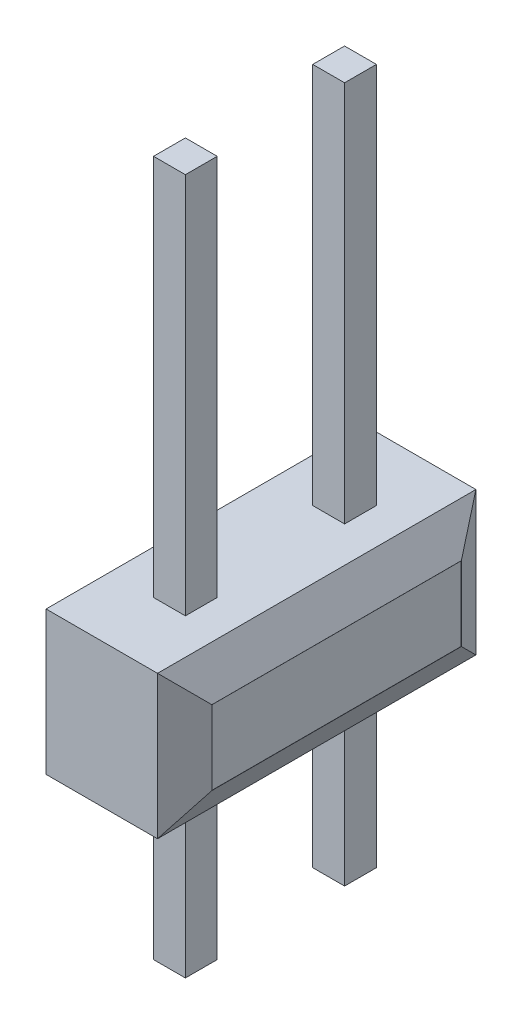
ISO-10303-21;
HEADER;
FILE_DESCRIPTION(('STEP AP214'),'2;1');
FILE_NAME('part.step','',(''),(''),'','','');
FILE_SCHEMA(('AUTOMOTIVE_DESIGN { 1 0 10303 214 1 1 1 1 }'));
ENDSEC;
DATA;
#1=APPLICATION_CONTEXT('core data for automotive mechanical design processes');
#2=APPLICATION_PROTOCOL_DEFINITION('international standard','automotive_design',2000,#1);
#3=PRODUCT_CONTEXT('',#1,'mechanical');
#4=PRODUCT('Part','Part','',(#3));
#5=PRODUCT_RELATED_PRODUCT_CATEGORY('part','',(#4));
#6=PRODUCT_DEFINITION_FORMATION('','',#4);
#7=PRODUCT_DEFINITION_CONTEXT('part definition',#1,'design');
#8=PRODUCT_DEFINITION('design','',#6,#7);
#9=PRODUCT_DEFINITION_SHAPE('','',#8);
#10=(LENGTH_UNIT() NAMED_UNIT(*) SI_UNIT(.MILLI.,.METRE.));
#11=(NAMED_UNIT(*) PLANE_ANGLE_UNIT() SI_UNIT($,.RADIAN.));
#12=(NAMED_UNIT(*) SI_UNIT($,.STERADIAN.) SOLID_ANGLE_UNIT());
#13=UNCERTAINTY_MEASURE_WITH_UNIT(LENGTH_MEASURE(1.E-05),#10,'distance_accuracy_value','');
#14=(GEOMETRIC_REPRESENTATION_CONTEXT(3) GLOBAL_UNCERTAINTY_ASSIGNED_CONTEXT((#13)) GLOBAL_UNIT_ASSIGNED_CONTEXT((#10,
#11,#12)) REPRESENTATION_CONTEXT('',''));
#15=CARTESIAN_POINT('',(0.,0.,0.));
#16=DIRECTION('',(0.,0.,1.));
#17=DIRECTION('',(1.,0.,0.));
#18=AXIS2_PLACEMENT_3D('',#15,#16,#17);
#19=CARTESIAN_POINT('',(-4.826,-1.143,2.032));
#20=DIRECTION('',(1.,0.,0.));
#21=DIRECTION('',(0.,0.,-1.));
#22=AXIS2_PLACEMENT_3D('',#19,#20,#21);
#23=PLANE('',#22);
#24=DIRECTION('',(0.,1.,0.));
#25=VECTOR('',#24,1.);
#26=CARTESIAN_POINT('',(-4.826,7.239,1.524));
#27=LINE('',#26,#25);
#28=CARTESIAN_POINT('',(-4.826,1.143,1.524));
#29=VERTEX_POINT('',#28);
#30=CARTESIAN_POINT('',(-4.826,7.239,1.524));
#31=VERTEX_POINT('',#30);
#32=EDGE_CURVE('E196',#29,#31,#27,.T.);
#33=ORIENTED_EDGE('',*,*,#32,.F.);
#34=DIRECTION('',(0.,0.,-1.));
#35=VECTOR('',#34,1.);
#36=CARTESIAN_POINT('',(-4.826,1.143,2.032));
#37=LINE('',#36,#35);
#38=CARTESIAN_POINT('',(-4.826,1.143,1.016));
#39=VERTEX_POINT('',#38);
#40=EDGE_CURVE('E20',#29,#39,#37,.T.);
#41=ORIENTED_EDGE('',*,*,#40,.T.);
#42=DIRECTION('',(0.,1.,0.));
#43=VECTOR('',#42,1.);
#44=CARTESIAN_POINT('',(-4.826,1.143,1.016));
#45=LINE('',#44,#43);
#46=CARTESIAN_POINT('',(-4.826,7.239,1.016));
#47=VERTEX_POINT('',#46);
#48=EDGE_CURVE('E194',#47,#39,#45,.F.);
#49=ORIENTED_EDGE('',*,*,#48,.F.);
#50=DIRECTION('',(0.,0.,1.));
#51=VECTOR('',#50,1.);
#52=CARTESIAN_POINT('',(-4.826,7.239,1.016));
#53=LINE('',#52,#51);
#54=EDGE_CURVE('E188',#31,#47,#53,.F.);
#55=ORIENTED_EDGE('',*,*,#54,.F.);
#56=EDGE_LOOP('',(#33,#41,#49,#55));
#57=FACE_BOUND('',#56,.T.);
#58=ADVANCED_FACE('F17',(#57),#23,.T.);
#59=CARTESIAN_POINT('',(-4.826,-1.143,2.032));
#60=DIRECTION('',(1.,0.,0.));
#61=DIRECTION('',(0.,0.,-1.));
#62=AXIS2_PLACEMENT_3D('',#59,#60,#61);
#63=PLANE('',#62);
#64=DIRECTION('',(0.,1.,0.));
#65=VECTOR('',#64,1.);
#66=CARTESIAN_POINT('',(-4.826,7.239,-1.016));
#67=LINE('',#66,#65);
#68=CARTESIAN_POINT('',(-4.826,1.143,-1.016));
#69=VERTEX_POINT('',#68);
#70=CARTESIAN_POINT('',(-4.826,7.239,-1.016));
#71=VERTEX_POINT('',#70);
#72=EDGE_CURVE('E226',#69,#71,#67,.T.);
#73=ORIENTED_EDGE('',*,*,#72,.F.);
#74=DIRECTION('',(0.,0.,-1.));
#75=VECTOR('',#74,1.);
#76=CARTESIAN_POINT('',(-4.826,1.143,2.032));
#77=LINE('',#76,#75);
#78=CARTESIAN_POINT('',(-4.826,1.143,-1.524));
#79=VERTEX_POINT('',#78);
#80=EDGE_CURVE('E200',#69,#79,#77,.T.);
#81=ORIENTED_EDGE('',*,*,#80,.T.);
#82=DIRECTION('',(0.,1.,0.));
#83=VECTOR('',#82,1.);
#84=CARTESIAN_POINT('',(-4.826,1.143,-1.524));
#85=LINE('',#84,#83);
#86=CARTESIAN_POINT('',(-4.826,7.239,-1.524));
#87=VERTEX_POINT('',#86);
#88=EDGE_CURVE('E224',#87,#79,#85,.F.);
#89=ORIENTED_EDGE('',*,*,#88,.F.);
#90=DIRECTION('',(0.,0.,1.));
#91=VECTOR('',#90,1.);
#92=CARTESIAN_POINT('',(-4.826,7.239,-1.524));
#93=LINE('',#92,#91);
#94=EDGE_CURVE('E241',#71,#87,#93,.F.);
#95=ORIENTED_EDGE('',*,*,#94,.F.);
#96=EDGE_LOOP('',(#73,#81,#89,#95));
#97=FACE_BOUND('',#96,.T.);
#98=ADVANCED_FACE('F222',(#97),#63,.T.);
#99=CARTESIAN_POINT('',(-3.937,0.593073868597,2.54));
#100=DIRECTION('',(0.866025403784329,-0.50000000000019,0.));
#101=DIRECTION('',(0.50000000000019,0.866025403784329,0.));
#102=AXIS2_PLACEMENT_3D('',#99,#100,#101);
#103=PLANE('',#102);
#104=DIRECTION('',(0.,0.,1.));
#105=VECTOR('',#104,1.);
#106=CARTESIAN_POINT('',(-3.93699999999993,0.59307386859704,2.54));
#107=LINE('',#106,#105);
#108=CARTESIAN_POINT('',(-3.93699999999996,0.59307386859701,-1.99007386859701));
#109=VERTEX_POINT('',#108);
#110=CARTESIAN_POINT('',(-3.93699999999999,0.59307386859701,1.99007386859701));
#111=VERTEX_POINT('',#110);
#112=EDGE_CURVE('E262',#109,#111,#107,.T.);
#113=ORIENTED_EDGE('',*,*,#112,.T.);
#114=DIRECTION('',(0.377964472999374,0.654653670731127,0.654653670690516));
#115=VECTOR('',#114,1.);
#116=CARTESIAN_POINT('',(-3.93800000000026,0.591341817789,1.98834181778915));
#117=LINE('',#116,#115);
#118=CARTESIAN_POINT('',(-3.93800000000011,0.591341817789027,1.98834181778904));
#119=VERTEX_POINT('',#118);
#120=EDGE_CURVE('E271',#119,#111,#117,.T.);
#121=ORIENTED_EDGE('',*,*,#120,.F.);
#122=DIRECTION('',(0.,0.,-1.));
#123=VECTOR('',#122,1.);
#124=CARTESIAN_POINT('',(-3.938,0.591341817789,2.032));
#125=LINE('',#124,#123);
#126=CARTESIAN_POINT('',(-3.93800000000014,0.591341817789053,-1.98834181778903));
#127=VERTEX_POINT('',#126);
#128=EDGE_CURVE('E276',#127,#119,#125,.F.);
#129=ORIENTED_EDGE('',*,*,#128,.F.);
#130=DIRECTION('',(0.377964472999283,0.654653670690359,-0.654653670731338));
#131=VECTOR('',#130,1.);
#132=CARTESIAN_POINT('',(-3.93800000000019,0.591341817789107,-1.988341817789));
#133=LINE('',#132,#131);
#134=EDGE_CURVE('E207',#127,#109,#133,.T.);
#135=ORIENTED_EDGE('',*,*,#134,.T.);
#136=EDGE_LOOP('',(#113,#121,#129,#135));
#137=FACE_BOUND('',#136,.T.);
#138=ADVANCED_FACE('F603',(#137),#103,.T.);
#139=CARTESIAN_POINT('',(-5.334,1.143,1.016));
#140=DIRECTION('',(0.,0.,-1.));
#141=DIRECTION('',(-1.,0.,0.));
#142=AXIS2_PLACEMENT_3D('',#139,#140,#141);
#143=PLANE('',#142);
#144=ORIENTED_EDGE('',*,*,#48,.T.);
#145=DIRECTION('',(-1.,0.,0.));
#146=VECTOR('',#145,1.);
#147=CARTESIAN_POINT('',(-5.334,1.143,1.016));
#148=LINE('',#147,#146);
#149=CARTESIAN_POINT('',(-5.334,1.143,1.016));
#150=VERTEX_POINT('',#149);
#151=EDGE_CURVE('E204',#39,#150,#148,.T.);
#152=ORIENTED_EDGE('',*,*,#151,.T.);
#153=DIRECTION('',(0.,1.,0.));
#154=VECTOR('',#153,1.);
#155=CARTESIAN_POINT('',(-5.334,-1.143,1.016));
#156=LINE('',#155,#154);
#157=CARTESIAN_POINT('',(-5.334,7.239,1.016));
#158=VERTEX_POINT('',#157);
#159=EDGE_CURVE('E256',#150,#158,#156,.T.);
#160=ORIENTED_EDGE('',*,*,#159,.T.);
#161=DIRECTION('',(1.,0.,0.));
#162=VECTOR('',#161,1.);
#163=CARTESIAN_POINT('',(-5.334,7.239,1.016));
#164=LINE('',#163,#162);
#165=EDGE_CURVE('E206',#47,#158,#164,.F.);
#166=ORIENTED_EDGE('',*,*,#165,.F.);
#167=EDGE_LOOP('',(#144,#152,#160,#166));
#168=FACE_BOUND('',#167,.T.);
#169=ADVANCED_FACE('F202',(#168),#143,.T.);
#170=CARTESIAN_POINT('',(-5.334,7.239,1.016));
#171=DIRECTION('',(0.,1.,0.));
#172=DIRECTION('',(0.,0.,1.));
#173=AXIS2_PLACEMENT_3D('',#170,#171,#172);
#174=PLANE('',#173);
#175=ORIENTED_EDGE('',*,*,#165,.T.);
#176=DIRECTION('',(0.,0.,-1.));
#177=VECTOR('',#176,1.);
#178=CARTESIAN_POINT('',(-5.334,7.239,2.032));
#179=LINE('',#178,#177);
#180=CARTESIAN_POINT('',(-5.334,7.239,1.524));
#181=VERTEX_POINT('',#180);
#182=EDGE_CURVE('E252',#158,#181,#179,.F.);
#183=ORIENTED_EDGE('',*,*,#182,.T.);
#184=DIRECTION('',(1.,0.,0.));
#185=VECTOR('',#184,1.);
#186=CARTESIAN_POINT('',(-5.334,7.239,1.524));
#187=LINE('',#186,#185);
#188=EDGE_CURVE('E247',#31,#181,#187,.F.);
#189=ORIENTED_EDGE('',*,*,#188,.F.);
#190=ORIENTED_EDGE('',*,*,#54,.T.);
#191=EDGE_LOOP('',(#175,#183,#189,#190));
#192=FACE_BOUND('',#191,.T.);
#193=ADVANCED_FACE('F251',(#192),#174,.T.);
#194=CARTESIAN_POINT('',(-5.334,7.239,1.524));
#195=DIRECTION('',(0.,0.,1.));
#196=DIRECTION('',(1.,0.,0.));
#197=AXIS2_PLACEMENT_3D('',#194,#195,#196);
#198=PLANE('',#197);
#199=DIRECTION('',(0.,1.,0.));
#200=VECTOR('',#199,1.);
#201=CARTESIAN_POINT('',(-5.334,-1.143,1.524));
#202=LINE('',#201,#200);
#203=CARTESIAN_POINT('',(-5.334,1.143,1.524));
#204=VERTEX_POINT('',#203);
#205=EDGE_CURVE('E258',#181,#204,#202,.F.);
#206=ORIENTED_EDGE('',*,*,#205,.T.);
#207=DIRECTION('',(1.,0.,0.));
#208=VECTOR('',#207,1.);
#209=CARTESIAN_POINT('',(-5.334,1.143,1.524));
#210=LINE('',#209,#208);
#211=EDGE_CURVE('E236',#204,#29,#210,.T.);
#212=ORIENTED_EDGE('',*,*,#211,.T.);
#213=ORIENTED_EDGE('',*,*,#32,.T.);
#214=ORIENTED_EDGE('',*,*,#188,.T.);
#215=EDGE_LOOP('',(#206,#212,#213,#214));
#216=FACE_BOUND('',#215,.T.);
#217=ADVANCED_FACE('F595',(#216),#198,.T.);
#218=CARTESIAN_POINT('',(-5.334,1.143,-1.524));
#219=DIRECTION('',(0.,0.,-1.));
#220=DIRECTION('',(-1.,0.,0.));
#221=AXIS2_PLACEMENT_3D('',#218,#219,#220);
#222=PLANE('',#221);
#223=ORIENTED_EDGE('',*,*,#88,.T.);
#224=DIRECTION('',(-1.,0.,0.));
#225=VECTOR('',#224,1.);
#226=CARTESIAN_POINT('',(-5.334,1.143,-1.524));
#227=LINE('',#226,#225);
#228=CARTESIAN_POINT('',(-5.334,1.143,-1.524));
#229=VERTEX_POINT('',#228);
#230=EDGE_CURVE('E233',#79,#229,#227,.T.);
#231=ORIENTED_EDGE('',*,*,#230,.T.);
#232=DIRECTION('',(0.,1.,0.));
#233=VECTOR('',#232,1.);
#234=CARTESIAN_POINT('',(-5.334,-1.143,-1.524));
#235=LINE('',#234,#233);
#236=CARTESIAN_POINT('',(-5.334,7.239,-1.524));
#237=VERTEX_POINT('',#236);
#238=EDGE_CURVE('E291',#229,#237,#235,.T.);
#239=ORIENTED_EDGE('',*,*,#238,.T.);
#240=DIRECTION('',(1.,0.,0.));
#241=VECTOR('',#240,1.);
#242=CARTESIAN_POINT('',(-5.334,7.239,-1.524));
#243=LINE('',#242,#241);
#244=EDGE_CURVE('E235',#87,#237,#243,.F.);
#245=ORIENTED_EDGE('',*,*,#244,.F.);
#246=EDGE_LOOP('',(#223,#231,#239,#245));
#247=FACE_BOUND('',#246,.T.);
#248=ADVANCED_FACE('F231',(#247),#222,.T.);
#249=CARTESIAN_POINT('',(-5.334,7.239,-1.524));
#250=DIRECTION('',(0.,1.,0.));
#251=DIRECTION('',(0.,0.,1.));
#252=AXIS2_PLACEMENT_3D('',#249,#250,#251);
#253=PLANE('',#252);
#254=ORIENTED_EDGE('',*,*,#244,.T.);
#255=DIRECTION('',(0.,0.,-1.));
#256=VECTOR('',#255,1.);
#257=CARTESIAN_POINT('',(-5.334,7.239,2.032));
#258=LINE('',#257,#256);
#259=CARTESIAN_POINT('',(-5.334,7.239,-1.016));
#260=VERTEX_POINT('',#259);
#261=EDGE_CURVE('E287',#237,#260,#258,.F.);
#262=ORIENTED_EDGE('',*,*,#261,.T.);
#263=DIRECTION('',(1.,0.,0.));
#264=VECTOR('',#263,1.);
#265=CARTESIAN_POINT('',(-5.334,7.239,-1.016));
#266=LINE('',#265,#264);
#267=EDGE_CURVE('E280',#71,#260,#266,.F.);
#268=ORIENTED_EDGE('',*,*,#267,.F.);
#269=ORIENTED_EDGE('',*,*,#94,.T.);
#270=EDGE_LOOP('',(#254,#262,#268,#269));
#271=FACE_BOUND('',#270,.T.);
#272=ADVANCED_FACE('F285',(#271),#253,.T.);
#273=CARTESIAN_POINT('',(-5.334,7.239,-1.016));
#274=DIRECTION('',(0.,0.,1.));
#275=DIRECTION('',(1.,0.,0.));
#276=AXIS2_PLACEMENT_3D('',#273,#274,#275);
#277=PLANE('',#276);
#278=DIRECTION('',(0.,1.,0.));
#279=VECTOR('',#278,1.);
#280=CARTESIAN_POINT('',(-5.334,-1.143,-1.016));
#281=LINE('',#280,#279);
#282=CARTESIAN_POINT('',(-5.334,1.143,-1.016));
#283=VERTEX_POINT('',#282);
#284=EDGE_CURVE('E293',#260,#283,#281,.F.);
#285=ORIENTED_EDGE('',*,*,#284,.T.);
#286=DIRECTION('',(1.,0.,0.));
#287=VECTOR('',#286,1.);
#288=CARTESIAN_POINT('',(-5.334,1.143,-1.016));
#289=LINE('',#288,#287);
#290=EDGE_CURVE('E278',#283,#69,#289,.T.);
#291=ORIENTED_EDGE('',*,*,#290,.T.);
#292=ORIENTED_EDGE('',*,*,#72,.T.);
#293=ORIENTED_EDGE('',*,*,#267,.T.);
#294=EDGE_LOOP('',(#285,#291,#292,#293));
#295=FACE_BOUND('',#294,.T.);
#296=ADVANCED_FACE('F586',(#295),#277,.T.);
#297=CARTESIAN_POINT('',(-3.938,-1.143,2.032));
#298=DIRECTION('',(1.,0.,0.));
#299=DIRECTION('',(0.,0.,-1.));
#300=AXIS2_PLACEMENT_3D('',#297,#298,#299);
#301=PLANE('',#300);
#302=DIRECTION('',(0.,1.,0.));
#303=VECTOR('',#302,1.);
#304=CARTESIAN_POINT('',(-3.93800000000026,1.143,1.98834181778915));
#305=LINE('',#304,#303);
#306=CARTESIAN_POINT('',(-3.93800000000002,-0.591341817789224,1.98834181778922));
#307=VERTEX_POINT('',#306);
#308=EDGE_CURVE('E273',#307,#119,#305,.T.);
#309=ORIENTED_EDGE('',*,*,#308,.F.);
#310=DIRECTION('',(0.,0.,1.));
#311=VECTOR('',#310,1.);
#312=CARTESIAN_POINT('',(-3.93799999999982,-0.591341817789898,2.54));
#313=LINE('',#312,#311);
#314=CARTESIAN_POINT('',(-3.938,-0.591341817789474,-1.98834181778903));
#315=VERTEX_POINT('',#314);
#316=EDGE_CURVE('E320',#315,#307,#313,.T.);
#317=ORIENTED_EDGE('',*,*,#316,.F.);
#318=DIRECTION('',(0.,1.,0.));
#319=VECTOR('',#318,1.);
#320=CARTESIAN_POINT('',(-3.93800000000019,1.143,-1.98834181778911));
#321=LINE('',#320,#319);
#322=EDGE_CURVE('E298',#127,#315,#321,.F.);
#323=ORIENTED_EDGE('',*,*,#322,.F.);
#324=ORIENTED_EDGE('',*,*,#128,.T.);
#325=EDGE_LOOP('',(#309,#317,#323,#324));
#326=FACE_BOUND('',#325,.T.);
#327=ADVANCED_FACE('F583',(#326),#301,.T.);
#328=CARTESIAN_POINT('',(-3.6195,1.143,2.54));
#329=DIRECTION('',(0.866025403784329,0.,-0.50000000000019));
#330=DIRECTION('',(-0.50000000000019,0.,-0.866025403784329));
#331=AXIS2_PLACEMENT_3D('',#328,#329,#330);
#332=PLANE('',#331);
#333=DIRECTION('',(0.,1.,0.));
#334=VECTOR('',#333,1.);
#335=CARTESIAN_POINT('',(-3.937,1.143,1.990073868597));
#336=LINE('',#335,#334);
#337=CARTESIAN_POINT('',(-3.93700000000003,-0.593073868597005,1.99007386859701));
#338=VERTEX_POINT('',#337);
#339=EDGE_CURVE('E310',#111,#338,#336,.F.);
#340=ORIENTED_EDGE('',*,*,#339,.T.);
#341=DIRECTION('',(0.377964472999364,-0.654653670690499,0.65465367073115));
#342=VECTOR('',#341,1.);
#343=CARTESIAN_POINT('',(-3.93800000000026,-0.591341817789148,1.988341817789));
#344=LINE('',#343,#342);
#345=EDGE_CURVE('E322',#307,#338,#344,.T.);
#346=ORIENTED_EDGE('',*,*,#345,.F.);
#347=ORIENTED_EDGE('',*,*,#308,.T.);
#348=ORIENTED_EDGE('',*,*,#120,.T.);
#349=EDGE_LOOP('',(#340,#346,#347,#348));
#350=FACE_BOUND('',#349,.T.);
#351=ADVANCED_FACE('F561',(#350),#332,.T.);
#352=CARTESIAN_POINT('',(-4.2545,1.143,2.54));
#353=DIRECTION('',(-0.866025403784329,-0.50000000000019,0.));
#354=DIRECTION('',(0.50000000000019,-0.866025403784329,0.));
#355=AXIS2_PLACEMENT_3D('',#352,#353,#354);
#356=PLANE('',#355);
#357=ORIENTED_EDGE('',*,*,#112,.F.);
#358=DIRECTION('',(0.37796447300938,-0.65465367070791,0.654653670707956));
#359=VECTOR('',#358,1.);
#360=CARTESIAN_POINT('',(-4.2545,1.143,-2.54));
#361=LINE('',#360,#359);
#362=CARTESIAN_POINT('',(-4.2545,1.143,-2.54));
#363=VERTEX_POINT('',#362);
#364=EDGE_CURVE('E268',#363,#109,#361,.T.);
#365=ORIENTED_EDGE('',*,*,#364,.F.);
#366=DIRECTION('',(0.,0.,1.));
#367=VECTOR('',#366,1.);
#368=CARTESIAN_POINT('',(-4.2545,1.143,0.));
#369=LINE('',#368,#367);
#370=CARTESIAN_POINT('',(-4.25450000000002,1.143,2.53999999999999));
#371=VERTEX_POINT('',#370);
#372=EDGE_CURVE('E328',#371,#363,#369,.F.);
#373=ORIENTED_EDGE('',*,*,#372,.F.);
#374=DIRECTION('',(0.377964473009379,-0.654653670707957,-0.65465367070791));
#375=VECTOR('',#374,1.);
#376=CARTESIAN_POINT('',(-4.25450000000007,1.143,2.53999999999996));
#377=LINE('',#376,#375);
#378=EDGE_CURVE('E307',#371,#111,#377,.T.);
#379=ORIENTED_EDGE('',*,*,#378,.T.);
#380=EDGE_LOOP('',(#357,#365,#373,#379));
#381=FACE_BOUND('',#380,.T.);
#382=ADVANCED_FACE('F567',(#381),#356,.F.);
#383=CARTESIAN_POINT('',(-6.19125,0.889,0.));
#384=DIRECTION('',(-0.847998304005144,0.52999894000309,0.));
#385=DIRECTION('',(-0.52999894000309,-0.847998304005144,0.));
#386=AXIS2_PLACEMENT_3D('',#383,#384,#385);
#387=PLANE('',#386);
#388=DIRECTION('',(0.,0.,1.));
#389=VECTOR('',#388,1.);
#390=CARTESIAN_POINT('',(-6.35,0.635,-2.032));
#391=LINE('',#390,#389);
#392=CARTESIAN_POINT('',(-6.34999999999999,0.634999999999996,2.032));
#393=VERTEX_POINT('',#392);
#394=CARTESIAN_POINT('',(-6.34999999999997,0.634999999999992,-2.03199999999999));
#395=VERTEX_POINT('',#394);
#396=EDGE_CURVE('E304',#393,#395,#391,.F.);
#397=ORIENTED_EDGE('',*,*,#396,.F.);
#398=DIRECTION('',(-0.404226041727153,-0.646761666763555,-0.646761666763598));
#399=VECTOR('',#398,1.);
#400=CARTESIAN_POINT('',(-6.03250000000005,1.143,2.54000000000003));
#401=LINE('',#400,#399);
#402=CARTESIAN_POINT('',(-6.03250000000002,1.14300000000001,2.54));
#403=VERTEX_POINT('',#402);
#404=EDGE_CURVE('E317',#403,#393,#401,.T.);
#405=ORIENTED_EDGE('',*,*,#404,.F.);
#406=DIRECTION('',(0.,0.,1.));
#407=VECTOR('',#406,1.);
#408=CARTESIAN_POINT('',(-6.0325,1.143,0.));
#409=LINE('',#408,#407);
#410=CARTESIAN_POINT('',(-6.03250000000001,1.14300000000001,-2.54));
#411=VERTEX_POINT('',#410);
#412=EDGE_CURVE('E331',#411,#403,#409,.T.);
#413=ORIENTED_EDGE('',*,*,#412,.F.);
#414=DIRECTION('',(-0.404226041727153,-0.646761666763597,0.646761666763555));
#415=VECTOR('',#414,1.);
#416=CARTESIAN_POINT('',(-6.03250000000003,1.14300000000002,-2.54));
#417=LINE('',#416,#415);
#418=EDGE_CURVE('E260',#411,#395,#417,.T.);
#419=ORIENTED_EDGE('',*,*,#418,.T.);
#420=EDGE_LOOP('',(#397,#405,#413,#419));
#421=FACE_BOUND('',#420,.T.);
#422=ADVANCED_FACE('F570',(#421),#387,.T.);
#423=CARTESIAN_POINT('',(-5.334,-1.143,2.032));
#424=DIRECTION('',(1.,0.,0.));
#425=DIRECTION('',(0.,0.,-1.));
#426=AXIS2_PLACEMENT_3D('',#423,#424,#425);
#427=PLANE('',#426);
#428=ORIENTED_EDGE('',*,*,#182,.F.);
#429=ORIENTED_EDGE('',*,*,#159,.F.);
#430=DIRECTION('',(0.,0.,1.));
#431=VECTOR('',#430,1.);
#432=CARTESIAN_POINT('',(-5.334,1.143,0.));
#433=LINE('',#432,#431);
#434=EDGE_CURVE('E213',#204,#150,#433,.F.);
#435=ORIENTED_EDGE('',*,*,#434,.F.);
#436=ORIENTED_EDGE('',*,*,#205,.F.);
#437=EDGE_LOOP('',(#428,#429,#435,#436));
#438=FACE_BOUND('',#437,.T.);
#439=ADVANCED_FACE('F255',(#438),#427,.F.);
#440=CARTESIAN_POINT('',(-5.334,-1.143,2.032));
#441=DIRECTION('',(1.,0.,0.));
#442=DIRECTION('',(0.,0.,-1.));
#443=AXIS2_PLACEMENT_3D('',#440,#441,#442);
#444=PLANE('',#443);
#445=ORIENTED_EDGE('',*,*,#261,.F.);
#446=ORIENTED_EDGE('',*,*,#238,.F.);
#447=DIRECTION('',(0.,0.,1.));
#448=VECTOR('',#447,1.);
#449=CARTESIAN_POINT('',(-5.334,1.143,0.));
#450=LINE('',#449,#448);
#451=EDGE_CURVE('E240',#283,#229,#450,.F.);
#452=ORIENTED_EDGE('',*,*,#451,.F.);
#453=ORIENTED_EDGE('',*,*,#284,.F.);
#454=EDGE_LOOP('',(#445,#446,#452,#453));
#455=FACE_BOUND('',#454,.T.);
#456=ADVANCED_FACE('F290',(#455),#444,.F.);
#457=CARTESIAN_POINT('',(-3.937,1.143,-1.990073868597));
#458=DIRECTION('',(0.866025403784329,0.,0.50000000000019));
#459=DIRECTION('',(0.50000000000019,0.,-0.866025403784329));
#460=AXIS2_PLACEMENT_3D('',#457,#458,#459);
#461=PLANE('',#460);
#462=DIRECTION('',(0.,1.,0.));
#463=VECTOR('',#462,1.);
#464=CARTESIAN_POINT('',(-3.93699999999993,1.143,-1.99007386859704));
#465=LINE('',#464,#463);
#466=CARTESIAN_POINT('',(-3.93700000000001,-0.59307386859701,-1.990073868597));
#467=VERTEX_POINT('',#466);
#468=EDGE_CURVE('E335',#467,#109,#465,.T.);
#469=ORIENTED_EDGE('',*,*,#468,.T.);
#470=ORIENTED_EDGE('',*,*,#134,.F.);
#471=ORIENTED_EDGE('',*,*,#322,.T.);
#472=DIRECTION('',(-0.37796447292921,0.65465367056884,0.654653670893312));
#473=VECTOR('',#472,1.);
#474=CARTESIAN_POINT('',(-3.93700000000007,-0.59307386859704,-1.990073868597));
#475=LINE('',#474,#473);
#476=EDGE_CURVE('E325',#467,#315,#475,.T.);
#477=ORIENTED_EDGE('',*,*,#476,.F.);
#478=EDGE_LOOP('',(#469,#470,#471,#477));
#479=FACE_BOUND('',#478,.T.);
#480=ADVANCED_FACE('F455',(#479),#461,.T.);
#481=CARTESIAN_POINT('',(-5.334,-3.8608,1.016));
#482=DIRECTION('',(0.,0.,-1.));
#483=DIRECTION('',(-1.,0.,0.));
#484=AXIS2_PLACEMENT_3D('',#481,#482,#483);
#485=PLANE('',#484);
#486=DIRECTION('',(0.,1.,0.));
#487=VECTOR('',#486,1.);
#488=CARTESIAN_POINT('',(-5.334,-1.143,1.016));
#489=LINE('',#488,#487);
#490=CARTESIAN_POINT('',(-5.334,-3.8608,1.016));
#491=VERTEX_POINT('',#490);
#492=CARTESIAN_POINT('',(-5.334,-1.143,1.016));
#493=VERTEX_POINT('',#492);
#494=EDGE_CURVE('E343',#491,#493,#489,.T.);
#495=ORIENTED_EDGE('',*,*,#494,.T.);
#496=DIRECTION('',(-1.,0.,0.));
#497=VECTOR('',#496,1.);
#498=CARTESIAN_POINT('',(-5.334,-1.143,1.016));
#499=LINE('',#498,#497);
#500=CARTESIAN_POINT('',(-4.826,-1.143,1.016));
#501=VERTEX_POINT('',#500);
#502=EDGE_CURVE('E300',#493,#501,#499,.F.);
#503=ORIENTED_EDGE('',*,*,#502,.T.);
#504=DIRECTION('',(0.,1.,0.));
#505=VECTOR('',#504,1.);
#506=CARTESIAN_POINT('',(-4.826,-1.143,1.016));
#507=LINE('',#506,#505);
#508=CARTESIAN_POINT('',(-4.826,-3.8608,1.016));
#509=VERTEX_POINT('',#508);
#510=EDGE_CURVE('E354',#509,#501,#507,.T.);
#511=ORIENTED_EDGE('',*,*,#510,.F.);
#512=DIRECTION('',(1.,0.,0.));
#513=VECTOR('',#512,1.);
#514=CARTESIAN_POINT('',(-5.334,-3.8608,1.016));
#515=LINE('',#514,#513);
#516=EDGE_CURVE('E346',#491,#509,#515,.T.);
#517=ORIENTED_EDGE('',*,*,#516,.F.);
#518=EDGE_LOOP('',(#495,#503,#511,#517));
#519=FACE_BOUND('',#518,.T.);
#520=ADVANCED_FACE('F452',(#519),#485,.T.);
#521=CARTESIAN_POINT('',(-5.334,-3.8608,-1.524));
#522=DIRECTION('',(0.,0.,-1.));
#523=DIRECTION('',(-1.,0.,0.));
#524=AXIS2_PLACEMENT_3D('',#521,#522,#523);
#525=PLANE('',#524);
#526=DIRECTION('',(0.,1.,0.));
#527=VECTOR('',#526,1.);
#528=CARTESIAN_POINT('',(-5.334,-1.143,-1.524));
#529=LINE('',#528,#527);
#530=CARTESIAN_POINT('',(-5.334,-3.8608,-1.524));
#531=VERTEX_POINT('',#530);
#532=CARTESIAN_POINT('',(-5.334,-1.143,-1.524));
#533=VERTEX_POINT('',#532);
#534=EDGE_CURVE('E361',#531,#533,#529,.T.);
#535=ORIENTED_EDGE('',*,*,#534,.T.);
#536=DIRECTION('',(-1.,0.,0.));
#537=VECTOR('',#536,1.);
#538=CARTESIAN_POINT('',(-5.334,-1.143,-1.524));
#539=LINE('',#538,#537);
#540=CARTESIAN_POINT('',(-4.826,-1.143,-1.524));
#541=VERTEX_POINT('',#540);
#542=EDGE_CURVE('E302',#533,#541,#539,.F.);
#543=ORIENTED_EDGE('',*,*,#542,.T.);
#544=DIRECTION('',(0.,1.,0.));
#545=VECTOR('',#544,1.);
#546=CARTESIAN_POINT('',(-4.826,-1.143,-1.524));
#547=LINE('',#546,#545);
#548=CARTESIAN_POINT('',(-4.826,-3.8608,-1.524));
#549=VERTEX_POINT('',#548);
#550=EDGE_CURVE('E372',#549,#541,#547,.T.);
#551=ORIENTED_EDGE('',*,*,#550,.F.);
#552=DIRECTION('',(1.,0.,0.));
#553=VECTOR('',#552,1.);
#554=CARTESIAN_POINT('',(-5.334,-3.8608,-1.524));
#555=LINE('',#554,#553);
#556=EDGE_CURVE('E364',#531,#549,#555,.T.);
#557=ORIENTED_EDGE('',*,*,#556,.F.);
#558=EDGE_LOOP('',(#535,#543,#551,#557));
#559=FACE_BOUND('',#558,.T.);
#560=ADVANCED_FACE('F454',(#559),#525,.T.);
#561=CARTESIAN_POINT('',(-6.35,-1.143,-2.032));
#562=DIRECTION('',(-1.,0.,0.));
#563=DIRECTION('',(0.,0.,1.));
#564=AXIS2_PLACEMENT_3D('',#561,#562,#563);
#565=PLANE('',#564);
#566=DIRECTION('',(0.,1.,0.));
#567=VECTOR('',#566,1.);
#568=CARTESIAN_POINT('',(-6.35,-1.143,2.032));
#569=LINE('',#568,#567);
#570=CARTESIAN_POINT('',(-6.34999999999999,-0.634999999999996,2.032));
#571=VERTEX_POINT('',#570);
#572=EDGE_CURVE('E315',#393,#571,#569,.F.);
#573=ORIENTED_EDGE('',*,*,#572,.F.);
#574=ORIENTED_EDGE('',*,*,#396,.T.);
#575=DIRECTION('',(0.,1.,0.));
#576=VECTOR('',#575,1.);
#577=CARTESIAN_POINT('',(-6.34999999999995,-1.143,-2.03199999999997));
#578=LINE('',#577,#576);
#579=CARTESIAN_POINT('',(-6.34999999999998,-0.634999999999996,-2.03199999999999));
#580=VERTEX_POINT('',#579);
#581=EDGE_CURVE('E338',#580,#395,#578,.T.);
#582=ORIENTED_EDGE('',*,*,#581,.F.);
#583=DIRECTION('',(0.,0.,1.));
#584=VECTOR('',#583,1.);
#585=CARTESIAN_POINT('',(-6.34999999999997,-0.634999999999983,0.));
#586=LINE('',#585,#584);
#587=EDGE_CURVE('E378',#571,#580,#586,.F.);
#588=ORIENTED_EDGE('',*,*,#587,.F.);
#589=EDGE_LOOP('',(#573,#574,#582,#588));
#590=FACE_BOUND('',#589,.T.);
#591=ADVANCED_FACE('F462',(#590),#565,.T.);
#592=CARTESIAN_POINT('',(-3.937,1.143,1.990073868597));
#593=DIRECTION('',(-0.866025403784329,0.,-0.50000000000019));
#594=DIRECTION('',(-0.50000000000019,0.,0.866025403784329));
#595=AXIS2_PLACEMENT_3D('',#592,#593,#594);
#596=PLANE('',#595);
#597=DIRECTION('',(-0.377964473009379,-0.654653670707957,0.65465367070791));
#598=VECTOR('',#597,1.);
#599=CARTESIAN_POINT('',(-3.937,-0.593073868597,1.990073868597));
#600=LINE('',#599,#598);
#601=CARTESIAN_POINT('',(-4.25450000000004,-1.143,2.53999999999998));
#602=VERTEX_POINT('',#601);
#603=EDGE_CURVE('E313',#338,#602,#600,.T.);
#604=ORIENTED_EDGE('',*,*,#603,.F.);
#605=ORIENTED_EDGE('',*,*,#339,.F.);
#606=ORIENTED_EDGE('',*,*,#378,.F.);
#607=DIRECTION('',(0.,1.,0.));
#608=VECTOR('',#607,1.);
#609=CARTESIAN_POINT('',(-4.2545,-1.143,2.54));
#610=LINE('',#609,#608);
#611=EDGE_CURVE('E382',#602,#371,#610,.T.);
#612=ORIENTED_EDGE('',*,*,#611,.F.);
#613=EDGE_LOOP('',(#604,#605,#606,#612));
#614=FACE_BOUND('',#613,.T.);
#615=ADVANCED_FACE('F529',(#614),#596,.F.);
#616=CARTESIAN_POINT('',(-6.35,-1.143,2.032));
#617=DIRECTION('',(-0.847998304005144,0.,0.52999894000309));
#618=DIRECTION('',(0.52999894000309,0.,0.847998304005144));
#619=AXIS2_PLACEMENT_3D('',#616,#617,#618);
#620=PLANE('',#619);
#621=DIRECTION('',(0.,1.,0.));
#622=VECTOR('',#621,1.);
#623=CARTESIAN_POINT('',(-6.0325,-1.143,2.54));
#624=LINE('',#623,#622);
#625=CARTESIAN_POINT('',(-6.03250000000003,-1.143,2.54000000000002));
#626=VERTEX_POINT('',#625);
#627=EDGE_CURVE('E388',#403,#626,#624,.F.);
#628=ORIENTED_EDGE('',*,*,#627,.F.);
#629=ORIENTED_EDGE('',*,*,#404,.T.);
#630=ORIENTED_EDGE('',*,*,#572,.T.);
#631=DIRECTION('',(-0.404226041727153,0.646761666763597,-0.646761666763555));
#632=VECTOR('',#631,1.);
#633=CARTESIAN_POINT('',(-6.03250000000003,-1.14300000000002,2.54));
#634=LINE('',#633,#632);
#635=EDGE_CURVE('E375',#626,#571,#634,.T.);
#636=ORIENTED_EDGE('',*,*,#635,.F.);
#637=EDGE_LOOP('',(#628,#629,#630,#636));
#638=FACE_BOUND('',#637,.T.);
#639=ADVANCED_FACE('F525',(#638),#620,.T.);
#640=CARTESIAN_POINT('',(-3.6195,-1.143,2.54));
#641=DIRECTION('',(0.866025403784329,0.50000000000019,0.));
#642=DIRECTION('',(-0.50000000000019,0.866025403784329,0.));
#643=AXIS2_PLACEMENT_3D('',#640,#641,#642);
#644=PLANE('',#643);
#645=DIRECTION('',(0.,0.,1.));
#646=VECTOR('',#645,1.);
#647=CARTESIAN_POINT('',(-3.937,-0.593073868597,2.54));
#648=LINE('',#647,#646);
#649=EDGE_CURVE('E390',#338,#467,#648,.F.);
#650=ORIENTED_EDGE('',*,*,#649,.T.);
#651=ORIENTED_EDGE('',*,*,#476,.T.);
#652=ORIENTED_EDGE('',*,*,#316,.T.);
#653=ORIENTED_EDGE('',*,*,#345,.T.);
#654=EDGE_LOOP('',(#650,#651,#652,#653));
#655=FACE_BOUND('',#654,.T.);
#656=ADVANCED_FACE('F522',(#655),#644,.T.);
#657=CARTESIAN_POINT('',(0.,1.143,0.));
#658=DIRECTION('',(0.,1.,0.));
#659=DIRECTION('',(0.,0.,1.));
#660=AXIS2_PLACEMENT_3D('',#657,#658,#659);
#661=PLANE('',#660);
#662=ORIENTED_EDGE('',*,*,#290,.F.);
#663=ORIENTED_EDGE('',*,*,#451,.T.);
#664=ORIENTED_EDGE('',*,*,#230,.F.);
#665=ORIENTED_EDGE('',*,*,#80,.F.);
#666=EDGE_LOOP('',(#662,#663,#664,#665));
#667=FACE_BOUND('',#666,.T.);
#668=ORIENTED_EDGE('',*,*,#211,.F.);
#669=ORIENTED_EDGE('',*,*,#434,.T.);
#670=ORIENTED_EDGE('',*,*,#151,.F.);
#671=ORIENTED_EDGE('',*,*,#40,.F.);
#672=EDGE_LOOP('',(#668,#669,#670,#671));
#673=FACE_BOUND('',#672,.T.);
#674=DIRECTION('',(-1.,0.,0.));
#675=VECTOR('',#674,1.);
#676=CARTESIAN_POINT('',(6.0325,1.143,-2.54));
#677=LINE('',#676,#675);
#678=EDGE_CURVE('E396',#411,#363,#677,.F.);
#679=ORIENTED_EDGE('',*,*,#678,.F.);
#680=ORIENTED_EDGE('',*,*,#412,.T.);
#681=DIRECTION('',(1.,0.,0.));
#682=VECTOR('',#681,1.);
#683=CARTESIAN_POINT('',(-6.0325,1.143,2.54));
#684=LINE('',#683,#682);
#685=EDGE_CURVE('E385',#371,#403,#684,.F.);
#686=ORIENTED_EDGE('',*,*,#685,.F.);
#687=ORIENTED_EDGE('',*,*,#372,.T.);
#688=EDGE_LOOP('',(#679,#680,#686,#687));
#689=FACE_BOUND('',#688,.T.);
#690=ADVANCED_FACE('F210',(#667,#673,#689),#661,.T.);
#691=CARTESIAN_POINT('',(-4.2545,1.143,-2.54));
#692=DIRECTION('',(-0.866025403784329,0.,0.50000000000019));
#693=DIRECTION('',(0.50000000000019,0.,0.866025403784329));
#694=AXIS2_PLACEMENT_3D('',#691,#692,#693);
#695=PLANE('',#694);
#696=DIRECTION('',(-0.37796447300938,-0.65465367070791,-0.654653670707956));
#697=VECTOR('',#696,1.);
#698=CARTESIAN_POINT('',(-3.937,-0.593073868597,-1.990073868597));
#699=LINE('',#698,#697);
#700=CARTESIAN_POINT('',(-4.25450000000002,-1.14299999999999,-2.54));
#701=VERTEX_POINT('',#700);
#702=EDGE_CURVE('E393',#467,#701,#699,.T.);
#703=ORIENTED_EDGE('',*,*,#702,.T.);
#704=DIRECTION('',(0.,1.,0.));
#705=VECTOR('',#704,1.);
#706=CARTESIAN_POINT('',(-4.2545,-1.143,-2.54));
#707=LINE('',#706,#705);
#708=EDGE_CURVE('E399',#363,#701,#707,.F.);
#709=ORIENTED_EDGE('',*,*,#708,.F.);
#710=ORIENTED_EDGE('',*,*,#364,.T.);
#711=ORIENTED_EDGE('',*,*,#468,.F.);
#712=EDGE_LOOP('',(#703,#709,#710,#711));
#713=FACE_BOUND('',#712,.T.);
#714=ADVANCED_FACE('F515',(#713),#695,.F.);
#715=CARTESIAN_POINT('',(-6.0325,-1.143,-2.54));
#716=DIRECTION('',(-0.847998304005144,0.,-0.52999894000309));
#717=DIRECTION('',(-0.52999894000309,0.,0.847998304005144));
#718=AXIS2_PLACEMENT_3D('',#715,#716,#717);
#719=PLANE('',#718);
#720=ORIENTED_EDGE('',*,*,#581,.T.);
#721=ORIENTED_EDGE('',*,*,#418,.F.);
#722=DIRECTION('',(0.,1.,0.));
#723=VECTOR('',#722,1.);
#724=CARTESIAN_POINT('',(-6.0325,-1.143,-2.54));
#725=LINE('',#724,#723);
#726=CARTESIAN_POINT('',(-6.03250000000001,-1.143,-2.54));
#727=VERTEX_POINT('',#726);
#728=EDGE_CURVE('E401',#727,#411,#725,.T.);
#729=ORIENTED_EDGE('',*,*,#728,.F.);
#730=DIRECTION('',(0.404226041727153,-0.646761666763597,-0.646761666763555));
#731=VECTOR('',#730,1.);
#732=CARTESIAN_POINT('',(-6.34999999999997,-0.634999999999983,-2.032));
#733=LINE('',#732,#731);
#734=EDGE_CURVE('E380',#580,#727,#733,.T.);
#735=ORIENTED_EDGE('',*,*,#734,.F.);
#736=EDGE_LOOP('',(#720,#721,#729,#735));
#737=FACE_BOUND('',#736,.T.);
#738=ADVANCED_FACE('F512',(#737),#719,.T.);
#739=CARTESIAN_POINT('',(-5.334,-1.143,2.032));
#740=DIRECTION('',(1.,0.,0.));
#741=DIRECTION('',(0.,0.,-1.));
#742=AXIS2_PLACEMENT_3D('',#739,#740,#741);
#743=PLANE('',#742);
#744=DIRECTION('',(0.,0.,-1.));
#745=VECTOR('',#744,1.);
#746=CARTESIAN_POINT('',(-5.334,-3.8608,1.524));
#747=LINE('',#746,#745);
#748=CARTESIAN_POINT('',(-5.334,-3.8608,1.524));
#749=VERTEX_POINT('',#748);
#750=EDGE_CURVE('E348',#749,#491,#747,.T.);
#751=ORIENTED_EDGE('',*,*,#750,.F.);
#752=DIRECTION('',(0.,1.,0.));
#753=VECTOR('',#752,1.);
#754=CARTESIAN_POINT('',(-5.334,-1.143,1.524));
#755=LINE('',#754,#753);
#756=CARTESIAN_POINT('',(-5.334,-1.143,1.524));
#757=VERTEX_POINT('',#756);
#758=EDGE_CURVE('E404',#757,#749,#755,.F.);
#759=ORIENTED_EDGE('',*,*,#758,.F.);
#760=DIRECTION('',(0.,0.,-1.));
#761=VECTOR('',#760,1.);
#762=CARTESIAN_POINT('',(-5.334,-1.143,2.032));
#763=LINE('',#762,#761);
#764=EDGE_CURVE('E341',#493,#757,#763,.F.);
#765=ORIENTED_EDGE('',*,*,#764,.F.);
#766=ORIENTED_EDGE('',*,*,#494,.F.);
#767=EDGE_LOOP('',(#751,#759,#765,#766));
#768=FACE_BOUND('',#767,.T.);
#769=ADVANCED_FACE('F442',(#768),#743,.F.);
#770=CARTESIAN_POINT('',(-5.334,-3.8608,1.524));
#771=DIRECTION('',(0.,-1.,0.));
#772=DIRECTION('',(0.,0.,-1.));
#773=AXIS2_PLACEMENT_3D('',#770,#771,#772);
#774=PLANE('',#773);
#775=DIRECTION('',(1.,0.,0.));
#776=VECTOR('',#775,1.);
#777=CARTESIAN_POINT('',(-5.334,-3.8608,1.524));
#778=LINE('',#777,#776);
#779=CARTESIAN_POINT('',(-4.826,-3.8608,1.524));
#780=VERTEX_POINT('',#779);
#781=EDGE_CURVE('E406',#749,#780,#778,.T.);
#782=ORIENTED_EDGE('',*,*,#781,.F.);
#783=ORIENTED_EDGE('',*,*,#750,.T.);
#784=ORIENTED_EDGE('',*,*,#516,.T.);
#785=DIRECTION('',(0.,0.,-1.));
#786=VECTOR('',#785,1.);
#787=CARTESIAN_POINT('',(-4.826,-3.8608,2.032));
#788=LINE('',#787,#786);
#789=EDGE_CURVE('E351',#780,#509,#788,.T.);
#790=ORIENTED_EDGE('',*,*,#789,.F.);
#791=EDGE_LOOP('',(#782,#783,#784,#790));
#792=FACE_BOUND('',#791,.T.);
#793=ADVANCED_FACE('F447',(#792),#774,.T.);
#794=CARTESIAN_POINT('',(-4.826,-1.143,2.032));
#795=DIRECTION('',(1.,0.,0.));
#796=DIRECTION('',(0.,0.,-1.));
#797=AXIS2_PLACEMENT_3D('',#794,#795,#796);
#798=PLANE('',#797);
#799=ORIENTED_EDGE('',*,*,#510,.T.);
#800=DIRECTION('',(0.,0.,-1.));
#801=VECTOR('',#800,1.);
#802=CARTESIAN_POINT('',(-4.826,-1.143,2.032));
#803=LINE('',#802,#801);
#804=CARTESIAN_POINT('',(-4.826,-1.143,1.524));
#805=VERTEX_POINT('',#804);
#806=EDGE_CURVE('E357',#501,#805,#803,.F.);
#807=ORIENTED_EDGE('',*,*,#806,.T.);
#808=DIRECTION('',(0.,1.,0.));
#809=VECTOR('',#808,1.);
#810=CARTESIAN_POINT('',(-4.826,-1.143,1.524));
#811=LINE('',#810,#809);
#812=EDGE_CURVE('E408',#780,#805,#811,.T.);
#813=ORIENTED_EDGE('',*,*,#812,.F.);
#814=ORIENTED_EDGE('',*,*,#789,.T.);
#815=EDGE_LOOP('',(#799,#807,#813,#814));
#816=FACE_BOUND('',#815,.T.);
#817=ADVANCED_FACE('F450',(#816),#798,.T.);
#818=CARTESIAN_POINT('',(-5.334,-1.143,2.032));
#819=DIRECTION('',(1.,0.,0.));
#820=DIRECTION('',(0.,0.,-1.));
#821=AXIS2_PLACEMENT_3D('',#818,#819,#820);
#822=PLANE('',#821);
#823=DIRECTION('',(0.,0.,-1.));
#824=VECTOR('',#823,1.);
#825=CARTESIAN_POINT('',(-5.334,-3.8608,-1.016));
#826=LINE('',#825,#824);
#827=CARTESIAN_POINT('',(-5.334,-3.8608,-1.016));
#828=VERTEX_POINT('',#827);
#829=EDGE_CURVE('E366',#828,#531,#826,.T.);
#830=ORIENTED_EDGE('',*,*,#829,.F.);
#831=DIRECTION('',(0.,1.,0.));
#832=VECTOR('',#831,1.);
#833=CARTESIAN_POINT('',(-5.334,-1.143,-1.016));
#834=LINE('',#833,#832);
#835=CARTESIAN_POINT('',(-5.334,-1.143,-1.016));
#836=VERTEX_POINT('',#835);
#837=EDGE_CURVE('E411',#836,#828,#834,.F.);
#838=ORIENTED_EDGE('',*,*,#837,.F.);
#839=DIRECTION('',(0.,0.,-1.));
#840=VECTOR('',#839,1.);
#841=CARTESIAN_POINT('',(-5.334,-1.143,2.032));
#842=LINE('',#841,#840);
#843=EDGE_CURVE('E359',#533,#836,#842,.F.);
#844=ORIENTED_EDGE('',*,*,#843,.F.);
#845=ORIENTED_EDGE('',*,*,#534,.F.);
#846=EDGE_LOOP('',(#830,#838,#844,#845));
#847=FACE_BOUND('',#846,.T.);
#848=ADVANCED_FACE('F501',(#847),#822,.F.);
#849=CARTESIAN_POINT('',(-5.334,-3.8608,-1.016));
#850=DIRECTION('',(0.,-1.,0.));
#851=DIRECTION('',(0.,0.,-1.));
#852=AXIS2_PLACEMENT_3D('',#849,#850,#851);
#853=PLANE('',#852);
#854=DIRECTION('',(1.,0.,0.));
#855=VECTOR('',#854,1.);
#856=CARTESIAN_POINT('',(-5.334,-3.8608,-1.016));
#857=LINE('',#856,#855);
#858=CARTESIAN_POINT('',(-4.826,-3.8608,-1.016));
#859=VERTEX_POINT('',#858);
#860=EDGE_CURVE('E413',#828,#859,#857,.T.);
#861=ORIENTED_EDGE('',*,*,#860,.F.);
#862=ORIENTED_EDGE('',*,*,#829,.T.);
#863=ORIENTED_EDGE('',*,*,#556,.T.);
#864=DIRECTION('',(0.,0.,-1.));
#865=VECTOR('',#864,1.);
#866=CARTESIAN_POINT('',(-4.826,-3.8608,2.032));
#867=LINE('',#866,#865);
#868=EDGE_CURVE('E369',#859,#549,#867,.T.);
#869=ORIENTED_EDGE('',*,*,#868,.F.);
#870=EDGE_LOOP('',(#861,#862,#863,#869));
#871=FACE_BOUND('',#870,.T.);
#872=ADVANCED_FACE('F498',(#871),#853,.T.);
#873=CARTESIAN_POINT('',(-4.826,-1.143,2.032));
#874=DIRECTION('',(1.,0.,0.));
#875=DIRECTION('',(0.,0.,-1.));
#876=AXIS2_PLACEMENT_3D('',#873,#874,#875);
#877=PLANE('',#876);
#878=ORIENTED_EDGE('',*,*,#550,.T.);
#879=DIRECTION('',(0.,0.,-1.));
#880=VECTOR('',#879,1.);
#881=CARTESIAN_POINT('',(-4.826,-1.143,2.032));
#882=LINE('',#881,#880);
#883=CARTESIAN_POINT('',(-4.826,-1.143,-1.016));
#884=VERTEX_POINT('',#883);
#885=EDGE_CURVE('E35',#541,#884,#882,.F.);
#886=ORIENTED_EDGE('',*,*,#885,.T.);
#887=DIRECTION('',(0.,1.,0.));
#888=VECTOR('',#887,1.);
#889=CARTESIAN_POINT('',(-4.826,-1.143,-1.016));
#890=LINE('',#889,#888);
#891=EDGE_CURVE('E415',#859,#884,#890,.T.);
#892=ORIENTED_EDGE('',*,*,#891,.F.);
#893=ORIENTED_EDGE('',*,*,#868,.T.);
#894=EDGE_LOOP('',(#878,#886,#892,#893));
#895=FACE_BOUND('',#894,.T.);
#896=ADVANCED_FACE('F494',(#895),#877,.T.);
#897=CARTESIAN_POINT('',(-6.19125,-0.889,0.));
#898=DIRECTION('',(-0.847998304005144,-0.52999894000309,0.));
#899=DIRECTION('',(0.52999894000309,-0.847998304005144,0.));
#900=AXIS2_PLACEMENT_3D('',#897,#898,#899);
#901=PLANE('',#900);
#902=ORIENTED_EDGE('',*,*,#587,.T.);
#903=ORIENTED_EDGE('',*,*,#734,.T.);
#904=DIRECTION('',(0.,0.,1.));
#905=VECTOR('',#904,1.);
#906=CARTESIAN_POINT('',(-6.0325,-1.143,0.));
#907=LINE('',#906,#905);
#908=EDGE_CURVE('E417',#727,#626,#907,.T.);
#909=ORIENTED_EDGE('',*,*,#908,.T.);
#910=ORIENTED_EDGE('',*,*,#635,.T.);
#911=EDGE_LOOP('',(#902,#903,#909,#910));
#912=FACE_BOUND('',#911,.T.);
#913=ADVANCED_FACE('F490',(#912),#901,.T.);
#914=CARTESIAN_POINT('',(-6.0325,-1.143,2.54));
#915=DIRECTION('',(0.,0.,1.));
#916=DIRECTION('',(1.,0.,0.));
#917=AXIS2_PLACEMENT_3D('',#914,#915,#916);
#918=PLANE('',#917);
#919=ORIENTED_EDGE('',*,*,#685,.T.);
#920=ORIENTED_EDGE('',*,*,#627,.T.);
#921=DIRECTION('',(1.,0.,0.));
#922=VECTOR('',#921,1.);
#923=CARTESIAN_POINT('',(0.,-1.143,2.54));
#924=LINE('',#923,#922);
#925=EDGE_CURVE('E420',#626,#602,#924,.T.);
#926=ORIENTED_EDGE('',*,*,#925,.T.);
#927=ORIENTED_EDGE('',*,*,#611,.T.);
#928=EDGE_LOOP('',(#919,#920,#926,#927));
#929=FACE_BOUND('',#928,.T.);
#930=ADVANCED_FACE('F486',(#929),#918,.T.);
#931=CARTESIAN_POINT('',(-3.937,-0.593073868597,2.54));
#932=DIRECTION('',(-0.866025403784329,0.50000000000019,0.));
#933=DIRECTION('',(-0.50000000000019,-0.866025403784329,0.));
#934=AXIS2_PLACEMENT_3D('',#931,#932,#933);
#935=PLANE('',#934);
#936=ORIENTED_EDGE('',*,*,#649,.F.);
#937=ORIENTED_EDGE('',*,*,#603,.T.);
#938=DIRECTION('',(0.,0.,1.));
#939=VECTOR('',#938,1.);
#940=CARTESIAN_POINT('',(-4.2545,-1.143,0.));
#941=LINE('',#940,#939);
#942=EDGE_CURVE('E423',#602,#701,#941,.F.);
#943=ORIENTED_EDGE('',*,*,#942,.T.);
#944=ORIENTED_EDGE('',*,*,#702,.F.);
#945=EDGE_LOOP('',(#936,#937,#943,#944));
#946=FACE_BOUND('',#945,.T.);
#947=ADVANCED_FACE('F482',(#946),#935,.F.);
#948=CARTESIAN_POINT('',(6.0325,-1.143,-2.54));
#949=DIRECTION('',(0.,0.,-1.));
#950=DIRECTION('',(-1.,0.,0.));
#951=AXIS2_PLACEMENT_3D('',#948,#949,#950);
#952=PLANE('',#951);
#953=DIRECTION('',(1.,0.,0.));
#954=VECTOR('',#953,1.);
#955=CARTESIAN_POINT('',(0.,-1.143,-2.54));
#956=LINE('',#955,#954);
#957=EDGE_CURVE('E426',#701,#727,#956,.F.);
#958=ORIENTED_EDGE('',*,*,#957,.T.);
#959=ORIENTED_EDGE('',*,*,#728,.T.);
#960=ORIENTED_EDGE('',*,*,#678,.T.);
#961=ORIENTED_EDGE('',*,*,#708,.T.);
#962=EDGE_LOOP('',(#958,#959,#960,#961));
#963=FACE_BOUND('',#962,.T.);
#964=ADVANCED_FACE('F479',(#963),#952,.T.);
#965=CARTESIAN_POINT('',(-5.334,-1.143,1.524));
#966=DIRECTION('',(0.,0.,1.));
#967=DIRECTION('',(1.,0.,0.));
#968=AXIS2_PLACEMENT_3D('',#965,#966,#967);
#969=PLANE('',#968);
#970=ORIENTED_EDGE('',*,*,#812,.T.);
#971=DIRECTION('',(1.,0.,0.));
#972=VECTOR('',#971,1.);
#973=CARTESIAN_POINT('',(0.,-1.143,1.524));
#974=LINE('',#973,#972);
#975=EDGE_CURVE('E26',#805,#757,#974,.F.);
#976=ORIENTED_EDGE('',*,*,#975,.T.);
#977=ORIENTED_EDGE('',*,*,#758,.T.);
#978=ORIENTED_EDGE('',*,*,#781,.T.);
#979=EDGE_LOOP('',(#970,#976,#977,#978));
#980=FACE_BOUND('',#979,.T.);
#981=ADVANCED_FACE('F432',(#980),#969,.T.);
#982=CARTESIAN_POINT('',(-5.334,-1.143,-1.016));
#983=DIRECTION('',(0.,0.,1.));
#984=DIRECTION('',(1.,0.,0.));
#985=AXIS2_PLACEMENT_3D('',#982,#983,#984);
#986=PLANE('',#985);
#987=ORIENTED_EDGE('',*,*,#891,.T.);
#988=DIRECTION('',(1.,0.,0.));
#989=VECTOR('',#988,1.);
#990=CARTESIAN_POINT('',(0.,-1.143,-1.016));
#991=LINE('',#990,#989);
#992=EDGE_CURVE('E11',#884,#836,#991,.F.);
#993=ORIENTED_EDGE('',*,*,#992,.T.);
#994=ORIENTED_EDGE('',*,*,#837,.T.);
#995=ORIENTED_EDGE('',*,*,#860,.T.);
#996=EDGE_LOOP('',(#987,#993,#994,#995));
#997=FACE_BOUND('',#996,.T.);
#998=ADVANCED_FACE('F468',(#997),#986,.T.);
#999=CARTESIAN_POINT('',(0.,-1.143,0.));
#1000=DIRECTION('',(0.,1.,0.));
#1001=DIRECTION('',(0.,0.,1.));
#1002=AXIS2_PLACEMENT_3D('',#999,#1000,#1001);
#1003=PLANE('',#1002);
#1004=ORIENTED_EDGE('',*,*,#885,.F.);
#1005=ORIENTED_EDGE('',*,*,#542,.F.);
#1006=ORIENTED_EDGE('',*,*,#843,.T.);
#1007=ORIENTED_EDGE('',*,*,#992,.F.);
#1008=EDGE_LOOP('',(#1004,#1005,#1006,#1007));
#1009=FACE_BOUND('',#1008,.T.);
#1010=ORIENTED_EDGE('',*,*,#806,.F.);
#1011=ORIENTED_EDGE('',*,*,#502,.F.);
#1012=ORIENTED_EDGE('',*,*,#764,.T.);
#1013=ORIENTED_EDGE('',*,*,#975,.F.);
#1014=EDGE_LOOP('',(#1010,#1011,#1012,#1013));
#1015=FACE_BOUND('',#1014,.T.);
#1016=ORIENTED_EDGE('',*,*,#942,.F.);
#1017=ORIENTED_EDGE('',*,*,#925,.F.);
#1018=ORIENTED_EDGE('',*,*,#908,.F.);
#1019=ORIENTED_EDGE('',*,*,#957,.F.);
#1020=EDGE_LOOP('',(#1016,#1017,#1018,#1019));
#1021=FACE_BOUND('',#1020,.T.);
#1022=ADVANCED_FACE('F438',(#1009,#1015,#1021),#1003,.F.);
#1023=CLOSED_SHELL('',(#58,#98,#138,#169,#193,#217,#248,#272,#296,#327,#351,#382,#422,#439,#456,
#480,#520,#560,#591,#615,#639,#656,#690,#714,#738,#769,#793,#817,#848,#872,#896,#913,#930,#947,
#964,#981,#998,#1022));
#1024=MANIFOLD_SOLID_BREP('B1',#1023);
#1025=ADVANCED_BREP_SHAPE_REPRESENTATION('',(#18,#1024),#14);
#1026=SHAPE_DEFINITION_REPRESENTATION(#9,#1025);
ENDSEC;
END-ISO-10303-21;
